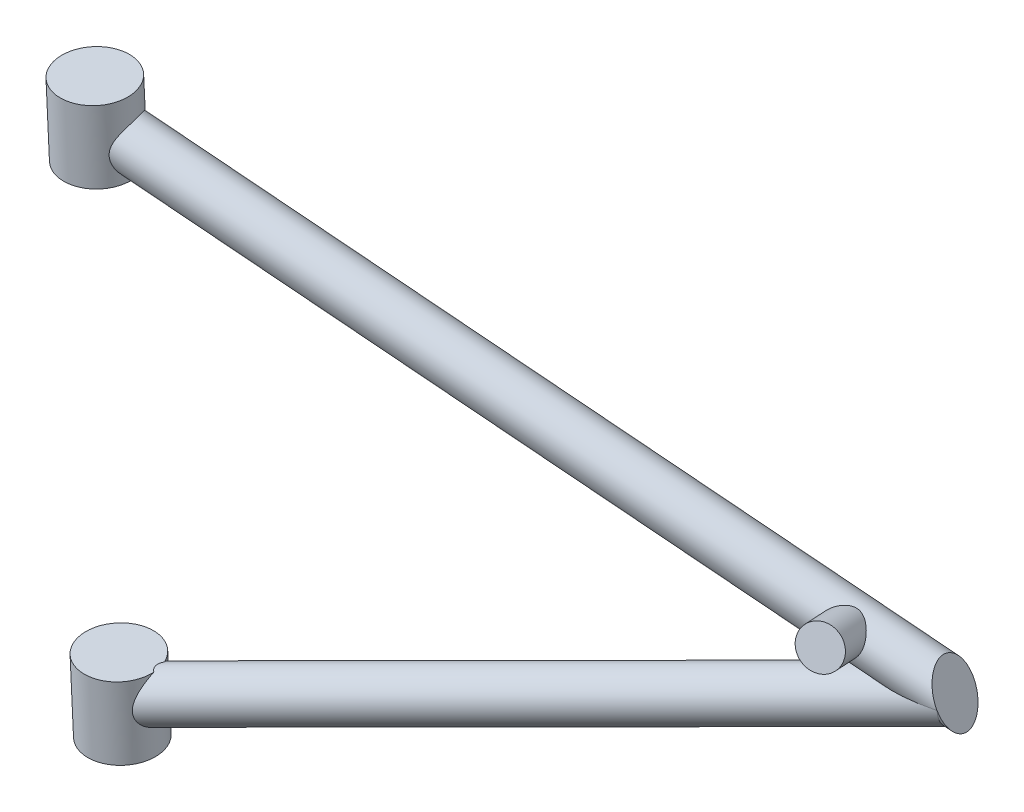
ISO-10303-21;
HEADER;
FILE_DESCRIPTION(('STEP AP214'),'2;1');
FILE_NAME('part.step','',(''),(''),'','','');
FILE_SCHEMA(('AUTOMOTIVE_DESIGN { 1 0 10303 214 1 1 1 1 }'));
ENDSEC;
DATA;
#1=APPLICATION_CONTEXT('core data for automotive mechanical design processes');
#2=APPLICATION_PROTOCOL_DEFINITION('international standard','automotive_design',2000,#1);
#3=PRODUCT_CONTEXT('',#1,'mechanical');
#4=PRODUCT('Part','Part','',(#3));
#5=PRODUCT_RELATED_PRODUCT_CATEGORY('part','',(#4));
#6=PRODUCT_DEFINITION_FORMATION('','',#4);
#7=PRODUCT_DEFINITION_CONTEXT('part definition',#1,'design');
#8=PRODUCT_DEFINITION('design','',#6,#7);
#9=PRODUCT_DEFINITION_SHAPE('','',#8);
#10=(LENGTH_UNIT() NAMED_UNIT(*) SI_UNIT(.MILLI.,.METRE.));
#11=(NAMED_UNIT(*) PLANE_ANGLE_UNIT() SI_UNIT($,.RADIAN.));
#12=(NAMED_UNIT(*) SI_UNIT($,.STERADIAN.) SOLID_ANGLE_UNIT());
#13=UNCERTAINTY_MEASURE_WITH_UNIT(LENGTH_MEASURE(1.E-05),#10,'distance_accuracy_value','');
#14=(GEOMETRIC_REPRESENTATION_CONTEXT(3) GLOBAL_UNCERTAINTY_ASSIGNED_CONTEXT((#13)) GLOBAL_UNIT_ASSIGNED_CONTEXT((#10,
#11,#12)) REPRESENTATION_CONTEXT('',''));
#15=CARTESIAN_POINT('',(0.,0.,0.));
#16=DIRECTION('',(0.,0.,1.));
#17=DIRECTION('',(1.,0.,0.));
#18=AXIS2_PLACEMENT_3D('',#15,#16,#17);
#19=CARTESIAN_POINT('',(255.,-221.47,-254.503));
#20=DIRECTION('',(0.912524270681738,0.366844617908996,-0.18089909266761));
#21=DIRECTION('',(-0.372998472957095,0.927831956321658,0.));
#22=AXIS2_PLACEMENT_3D('',#19,#20,#21);
#23=CYLINDRICAL_SURFACE('',#22,9.52500000000002);
#24=CARTESIAN_POINT('',(293.242179047782,-206.096230762816,-262.084141360994));
#25=DIRECTION('',(0.,0.998892249777093,0.0470560658710238));
#26=DIRECTION('',(0.977268280554209,0.00997618647777122,-0.211771536156257));
#27=AXIS2_PLACEMENT_3D('',#24,#25,#26);
#28=ELLIPSE('',#27,26.6116574264945,9.52500000000002);
#29=CARTESIAN_POINT('',(268.999181284131,-206.479491491884,-253.948395951266));
#30=VERTEX_POINT('',#29);
#31=CARTESIAN_POINT('',(267.803485256219,-206.220132528784,-259.453991316177));
#32=VERTEX_POINT('',#31);
#33=EDGE_CURVE('E105',#30,#32,#28,.F.);
#34=ORIENTED_EDGE('',*,*,#33,.F.);
#35=CARTESIAN_POINT('',(267.803485256219,-206.220132528784,-259.453991316177));
#36=CARTESIAN_POINT('',(267.697365527533,-206.314287046579,-259.698635479323));
#37=CARTESIAN_POINT('',(267.586764390849,-206.42159580225,-259.935753123484));
#38=CARTESIAN_POINT('',(267.3590656013,-206.659148812205,-260.394082141548));
#39=CARTESIAN_POINT('',(267.241984498495,-206.789336331361,-260.615330999056));
#40=CARTESIAN_POINT('',(266.886711742009,-207.206658583498,-261.250682509158));
#41=CARTESIAN_POINT('',(266.641879237606,-207.522929172958,-261.642177585505));
#42=CARTESIAN_POINT('',(266.235273501451,-208.092730241839,-262.239418803081));
#43=CARTESIAN_POINT('',(266.074316155262,-208.329666023735,-262.462324034543));
#44=CARTESIAN_POINT('',(265.753981376019,-208.824652753416,-262.884808049921));
#45=CARTESIAN_POINT('',(265.594604180185,-209.08270681934,-263.084383378549));
#46=CARTESIAN_POINT('',(265.279342301922,-209.618803267741,-263.462697257364));
#47=CARTESIAN_POINT('',(265.123488835937,-209.896969922729,-263.641284482501));
#48=CARTESIAN_POINT('',(264.819309695939,-210.469689099346,-263.97724993632));
#49=CARTESIAN_POINT('',(264.670983486587,-210.764240452564,-264.1346296746));
#50=CARTESIAN_POINT('',(264.381269831893,-211.376181258596,-264.432862120423));
#51=CARTESIAN_POINT('',(264.240163394191,-211.693965555147,-264.573178177829));
#52=CARTESIAN_POINT('',(263.973061649822,-212.344290165365,-264.832817021957));
#53=CARTESIAN_POINT('',(263.847070291525,-212.676834303664,-264.952134327155));
#54=CARTESIAN_POINT('',(263.615479530347,-213.35418344376,-265.169010362527));
#55=CARTESIAN_POINT('',(263.509796042121,-213.698930568173,-265.266659084283));
#56=CARTESIAN_POINT('',(263.323918613269,-214.40060892788,-265.439720146905));
#57=CARTESIAN_POINT('',(263.243704957851,-214.757530501437,-265.515149683131));
#58=CARTESIAN_POINT('',(263.140757197253,-215.337931157684,-265.616682171021));
#59=CARTESIAN_POINT('',(263.107839746575,-215.558288084853,-265.650490284906));
#60=CARTESIAN_POINT('',(263.055221234641,-216.001787504313,-265.708623035463));
#61=CARTESIAN_POINT('',(263.035515613435,-216.224929008417,-265.732950942932));
#62=CARTESIAN_POINT('',(263.010753298342,-216.6726776378,-265.771379849267));
#63=CARTESIAN_POINT('',(263.005680130779,-216.897282829338,-265.785492335551));
#64=CARTESIAN_POINT('',(263.011298244634,-217.346752682923,-265.80274430895));
#65=CARTESIAN_POINT('',(263.021989511733,-217.571617344735,-265.805883806031));
#66=CARTESIAN_POINT('',(263.059984423546,-218.021655112976,-265.800397176217));
#67=CARTESIAN_POINT('',(263.0874217406,-218.246816002228,-265.791675675815));
#68=CARTESIAN_POINT('',(263.159066383468,-218.693611930885,-265.761625241399));
#69=CARTESIAN_POINT('',(263.203273557364,-218.915247002211,-265.740296421595));
#70=CARTESIAN_POINT('',(263.30776437712,-219.353093275263,-265.684545181846));
#71=CARTESIAN_POINT('',(263.368053812421,-219.569302493014,-265.650118044742));
#72=CARTESIAN_POINT('',(263.503297097006,-219.994461443992,-265.567923797466));
#73=CARTESIAN_POINT('',(263.578250721479,-220.203411288453,-265.520156891796));
#74=CARTESIAN_POINT('',(263.733171590505,-220.593225138195,-265.416430865558));
#75=CARTESIAN_POINT('',(263.811987994475,-220.774872676237,-265.36167938882));
#76=CARTESIAN_POINT('',(263.978462432031,-221.130423154988,-265.241300951544));
#77=CARTESIAN_POINT('',(264.06612389616,-221.3043230528,-265.175669764933));
#78=CARTESIAN_POINT('',(264.24857889433,-221.643813586958,-265.03371158526));
#79=CARTESIAN_POINT('',(264.343372946659,-221.80940361801,-264.957383814584));
#80=CARTESIAN_POINT('',(264.538437505506,-222.131975916435,-264.794240719237));
#81=CARTESIAN_POINT('',(264.638708684581,-222.288957121931,-264.707424105006));
#82=CARTESIAN_POINT('',(264.856080793585,-222.613432512373,-264.511904137335));
#83=CARTESIAN_POINT('',(264.973706227715,-222.77974489652,-264.401821371604));
#84=CARTESIAN_POINT('',(265.211812817542,-223.101071675487,-264.168997659305));
#85=CARTESIAN_POINT('',(265.332294133555,-223.25608543406,-264.046256000829));
#86=CARTESIAN_POINT('',(265.574267969116,-223.554796284649,-263.788422034612));
#87=CARTESIAN_POINT('',(265.695760939554,-223.698487995004,-263.653323918668));
#88=CARTESIAN_POINT('',(265.937968608628,-223.9743822208,-263.371221770743));
#89=CARTESIAN_POINT('',(266.058683267141,-224.106584148258,-263.224217130196));
#90=CARTESIAN_POINT('',(266.316388873185,-224.379086894282,-262.894911525225));
#91=CARTESIAN_POINT('',(266.452983883531,-224.517438018628,-262.710680519274));
#92=CARTESIAN_POINT('',(266.720771944835,-224.778357387148,-262.327661237535));
#93=CARTESIAN_POINT('',(266.851964487,-224.900924147083,-262.128871595517));
#94=CARTESIAN_POINT('',(267.106914603057,-225.129934865831,-261.717650437763));
#95=CARTESIAN_POINT('',(267.230671343288,-225.236377018868,-261.505217397907));
#96=CARTESIAN_POINT('',(267.468876424041,-225.43271743723,-261.067853372235));
#97=CARTESIAN_POINT('',(267.583325023973,-225.522616163696,-260.842922735012));
#98=CARTESIAN_POINT('',(267.802315193678,-225.686237507517,-260.379654071813));
#99=CARTESIAN_POINT('',(267.906750630271,-225.759795842173,-260.141207706006));
#100=CARTESIAN_POINT('',(268.102975695885,-225.889205563581,-259.654493838866));
#101=CARTESIAN_POINT('',(268.194765111246,-225.945056651182,-259.406226171689));
#102=CARTESIAN_POINT('',(268.36445666864,-226.038678078082,-258.901741183751));
#103=CARTESIAN_POINT('',(268.44236278672,-226.076453599294,-258.645526163796));
#104=CARTESIAN_POINT('',(268.583397962621,-226.133680431828,-258.127059212255));
#105=CARTESIAN_POINT('',(268.646527716311,-226.15313260619,-257.864807565594));
#106=CARTESIAN_POINT('',(268.75456089052,-226.173041180107,-257.350001463026));
#107=CARTESIAN_POINT('',(268.800236085503,-226.17442507342,-257.097643977992));
#108=CARTESIAN_POINT('',(268.87754495621,-226.160559049983,-256.591249747588));
#109=CARTESIAN_POINT('',(268.909179149581,-226.145309746517,-256.337213064475));
#110=CARTESIAN_POINT('',(268.958465129282,-226.098254186145,-255.829342197431));
#111=CARTESIAN_POINT('',(268.97611791716,-226.066449115471,-255.575508000297));
#112=CARTESIAN_POINT('',(268.997780159279,-225.986437433502,-255.06985384672));
#113=CARTESIAN_POINT('',(269.001789410141,-225.938230577724,-254.818033920359));
#114=CARTESIAN_POINT('',(268.996762287689,-225.825707993507,-254.318544779101));
#115=CARTESIAN_POINT('',(268.987744850636,-225.761415759862,-254.070870067635));
#116=CARTESIAN_POINT('',(268.957530962621,-225.616923119472,-253.580973567274));
#117=CARTESIAN_POINT('',(268.936334552204,-225.536722765687,-253.338751760229));
#118=CARTESIAN_POINT('',(268.882802768389,-225.360597511825,-252.861222854839));
#119=CARTESIAN_POINT('',(268.850461702744,-225.264664589324,-252.625919356878));
#120=CARTESIAN_POINT('',(268.775907958965,-225.057297669075,-252.163861958913));
#121=CARTESIAN_POINT('',(268.733694983814,-224.94586320497,-251.937108316386));
#122=CARTESIAN_POINT('',(268.638427804418,-224.70137759742,-251.481962002));
#123=CARTESIAN_POINT('',(268.584920879624,-224.567498865722,-251.254107944126));
#124=CARTESIAN_POINT('',(268.470559133134,-224.282804564353,-250.811147094706));
#125=CARTESIAN_POINT('',(268.409703629115,-224.13198742202,-250.596041489638));
#126=CARTESIAN_POINT('',(268.282914006161,-223.81350185564,-250.180367343564));
#127=CARTESIAN_POINT('',(268.21698123708,-223.645837906937,-249.979794966055));
#128=CARTESIAN_POINT('',(268.082581578995,-223.293675776162,-249.59495297393));
#129=CARTESIAN_POINT('',(268.014115195036,-223.109180938497,-249.410680134762));
#130=CARTESIAN_POINT('',(267.889441483938,-222.757180467935,-249.090924796078));
#131=CARTESIAN_POINT('',(267.83317936084,-222.592326466294,-248.952538990793));
#132=CARTESIAN_POINT('',(267.722651266223,-222.25151404732,-248.689326778223));
#133=CARTESIAN_POINT('',(267.668384903767,-222.075557823276,-248.564497705929));
#134=CARTESIAN_POINT('',(267.563747133932,-221.713228224221,-248.329677098308));
#135=CARTESIAN_POINT('',(267.513370789218,-221.526868589261,-248.219666618114));
#136=CARTESIAN_POINT('',(267.4182587498,-221.144323935223,-248.015368122386));
#137=CARTESIAN_POINT('',(267.373523009128,-220.948138996235,-247.92107997872));
#138=CARTESIAN_POINT('',(267.291137225037,-220.546013503638,-247.748638257899));
#139=CARTESIAN_POINT('',(267.2535278762,-220.340024858359,-247.670577111481));
#140=CARTESIAN_POINT('',(267.187082074715,-219.920901255214,-247.531833206973));
#141=CARTESIAN_POINT('',(267.158245482821,-219.707766410837,-247.471150173047));
#142=CARTESIAN_POINT('',(267.110235562994,-219.276173299073,-247.367297249279));
#143=CARTESIAN_POINT('',(267.091064070753,-219.05771402867,-247.324130686644));
#144=CARTESIAN_POINT('',(267.062724596509,-218.617469337366,-247.255007864885));
#145=CARTESIAN_POINT('',(267.053556655437,-218.395683902859,-247.229051676181));
#146=CARTESIAN_POINT('',(267.045348670539,-217.968250588951,-247.19502778059));
#147=CARTESIAN_POINT('',(267.045565007181,-217.762713603364,-247.185707712271));
#148=CARTESIAN_POINT('',(267.053792930777,-217.351595295943,-247.180270105336));
#149=CARTESIAN_POINT('',(267.061807327794,-217.146013984837,-247.184157327279));
#150=CARTESIAN_POINT('',(267.096519483449,-216.530787761495,-247.214349430058));
#151=CARTESIAN_POINT('',(267.133884626441,-216.122537567518,-247.259176045046));
#152=CARTESIAN_POINT('',(267.222325638461,-215.381368977004,-247.380627271946));
#153=CARTESIAN_POINT('',(267.270207937088,-215.046942942879,-247.450938854214));
#154=CARTESIAN_POINT('',(267.377018936706,-214.386439361572,-247.618189330147));
#155=CARTESIAN_POINT('',(267.435954174913,-214.060366885459,-247.71514399763));
#156=CARTESIAN_POINT('',(267.561389779737,-213.416716646475,-247.9336507454));
#157=CARTESIAN_POINT('',(267.627918198398,-213.099176112066,-248.055295417468));
#158=CARTESIAN_POINT('',(267.765029228637,-212.474758490432,-248.321306075396));
#159=CARTESIAN_POINT('',(267.835611193412,-212.167879714442,-248.465668442679));
#160=CARTESIAN_POINT('',(267.980843351858,-211.553014635479,-248.782694691098));
#161=CARTESIAN_POINT('',(268.0555401776,-211.245519516577,-248.956290190469));
#162=CARTESIAN_POINT('',(268.202991109672,-210.644308733987,-249.32672039377));
#163=CARTESIAN_POINT('',(268.275745048135,-210.350594259308,-249.523557097843));
#164=CARTESIAN_POINT('',(268.415818484292,-209.780532346564,-249.939235286135));
#165=CARTESIAN_POINT('',(268.483167743511,-209.504091965957,-250.15793886129));
#166=CARTESIAN_POINT('',(268.609798910895,-208.969228518461,-250.618611208845));
#167=CARTESIAN_POINT('',(268.669081435061,-208.710804076553,-250.860578202365));
#168=CARTESIAN_POINT('',(268.765852461967,-208.26341636258,-251.318946387353));
#169=CARTESIAN_POINT('',(268.805338585521,-208.070684366789,-251.531243647368));
#170=CARTESIAN_POINT('',(268.874936386724,-207.701749340829,-251.970974377624));
#171=CARTESIAN_POINT('',(268.905055549102,-207.525533192642,-252.198395585667));
#172=CARTESIAN_POINT('',(268.95419156177,-207.190432647219,-252.670920659274));
#173=CARTESIAN_POINT('',(268.973077255322,-207.031769957774,-252.916197267341));
#174=CARTESIAN_POINT('',(268.997070890751,-206.73735109464,-253.421580500344));
#175=CARTESIAN_POINT('',(269.002142266349,-206.601656605006,-253.681724626914));
#176=CARTESIAN_POINT('',(268.999181284131,-206.479491491884,-253.948395951266));
#177=B_SPLINE_CURVE_WITH_KNOTS('',3,(#35,#36,#37,#38,#39,#40,#41,#42,#43,#44,#45,#46,#47,#48,
#49,#50,#51,#52,#53,#54,#55,#56,#57,#58,#59,#60,#61,#62,#63,#64,#65,#66,#67,#68,#69,#70,#71,#72,
#73,#74,#75,#76,#77,#78,#79,#80,#81,#82,#83,#84,#85,#86,#87,#88,#89,#90,#91,#92,#93,#94,#95,#96,
#97,#98,#99,#100,#101,#102,#103,#104,#105,#106,#107,#108,#109,#110,#111,#112,#113,#114,#115,
#116,#117,#118,#119,#120,#121,#122,#123,#124,#125,#126,#127,#128,#129,#130,#131,#132,#133,#134,
#135,#136,#137,#138,#139,#140,#141,#142,#143,#144,#145,#146,#147,#148,#149,#150,#151,#152,#153,
#154,#155,#156,#157,#158,#159,#160,#161,#162,#163,#164,#165,#166,#167,#168,#169,#170,#171,#172,
#173,#174,#175,#176),.UNSPECIFIED.,.F.,.F.,(4,2,2,2,2,2,2,2,2,2,2,2,2,2,2,2,2,2,2,2,2,2,2,2,2,2,
2,2,2,2,2,2,2,2,2,2,2,2,2,2,2,2,2,2,2,2,2,2,2,2,2,2,2,2,2,2,2,2,2,2,2,2,2,2,2,2,2,2,2,2,4),(0.,
0.847248957157209,1.69242580052789,3.3627657640452,4.45048572585789,5.53836658145481,
6.63366380567474,7.7288830228253,8.85260269563985,9.97661527103477,11.0958685200099,
12.214253292855,12.8897999019046,13.5651132316117,14.2396659749776,14.9142181056374,
15.594226457347,16.2742286490018,16.9544759652561,17.6347128537404,18.2503947330981,
18.8663163283093,19.4822827225457,20.0983249244541,20.7922888745161,21.4862918728688,
22.1806227833065,22.8749892047906,23.6775899204243,24.4802660513897,25.2830320066978,
26.0857755818625,26.8962571907386,27.7067524913827,28.517015299415,29.3272399417498,
30.0956997057354,30.8641311366941,31.6325075166236,32.4008953503885,33.1681673395538,
33.935436774422,34.7030986823461,35.4707836899619,36.2787608460513,37.0868130815586,
37.8946512231765,38.7023291903113,39.3690957519282,40.0357310011377,40.7015057318462,
41.3672750364114,42.0367385694382,42.7061914757579,43.3757714834116,44.0453542307185,
44.6619834053258,45.2788348670851,46.5121712393655,47.5460979811356,48.580638174395,
49.6191322393976,50.6574610554916,51.7392464537718,52.8211250187368,53.8965658681635,
54.9719245473783,55.8393415741109,56.7060636942321,57.5827161452231,58.4616868366877),.UNSPECIFIED.);
#178=EDGE_CURVE('E92',#32,#30,#177,.T.);
#179=ORIENTED_EDGE('',*,*,#178,.F.);
#180=EDGE_LOOP('',(#34,#179));
#181=FACE_BOUND('',#180,.T.);
#182=CARTESIAN_POINT('',(536.966082,-108.116588,-310.400043));
#183=DIRECTION('',(0.977042799081254,0.0314302037809526,-0.210711914835768));
#184=DIRECTION('',(-0.0209918277884314,0.998447490299481,0.0515941109116967));
#185=AXIS2_PLACEMENT_3D('',#182,#183,#184);
#186=ELLIPSE('',#185,10.1198136751925,9.525);
#187=CARTESIAN_POINT('',(538.985442921555,-108.554608710622,-301.10187413051));
#188=VERTEX_POINT('',#187);
#189=CARTESIAN_POINT('',(534.946721078445,-107.678567289377,-319.69821186949));
#190=VERTEX_POINT('',#189);
#191=EDGE_CURVE('E99',#188,#190,#186,.T.);
#192=ORIENTED_EDGE('',*,*,#191,.F.);
#193=CARTESIAN_POINT('',(536.966082,-108.116588,-310.400043));
#194=DIRECTION('',(-0.0209918277884314,0.998447490299481,0.0515941109116967));
#195=DIRECTION('',(0.977042799081254,0.0314302037809526,-0.210711914835768));
#196=AXIS2_PLACEMENT_3D('',#193,#194,#195);
#197=ELLIPSE('',#196,28.1983093968674,9.525);
#198=EDGE_CURVE('E127',#190,#188,#197,.T.);
#199=ORIENTED_EDGE('',*,*,#198,.F.);
#200=EDGE_LOOP('',(#192,#199));
#201=FACE_BOUND('',#200,.T.);
#202=ADVANCED_FACE('F73',(#181,#201),#23,.T.);
#203=CARTESIAN_POINT('',(255.,-14.5,-244.753));
#204=DIRECTION('',(0.926705770492292,-0.307678965136663,-0.215754650815965));
#205=DIRECTION('',(0.31510033175296,0.949058365396552,0.));
#206=AXIS2_PLACEMENT_3D('',#203,#204,#205);
#207=CYLINDRICAL_SURFACE('',#206,9.52499999999998);
#208=CARTESIAN_POINT('',(514.169204189501,-94.7190660498519,-296.745579792432));
#209=CARTESIAN_POINT('',(514.133007267729,-94.5160653435042,-296.856275994335));
#210=CARTESIAN_POINT('',(514.08578448019,-94.3166180222697,-296.969746028495));
#211=CARTESIAN_POINT('',(513.970908692809,-93.9259385091876,-297.200602301141));
#212=CARTESIAN_POINT('',(513.903245780682,-93.7347103546735,-297.317990415047));
#213=CARTESIAN_POINT('',(513.74912434652,-93.3611517284951,-297.555161649635));
#214=CARTESIAN_POINT('',(513.662637925749,-93.1788349610721,-297.674948083048));
#215=CARTESIAN_POINT('',(513.472633354761,-92.8238631872533,-297.915207480398));
#216=CARTESIAN_POINT('',(513.369117068813,-92.6512071260628,-298.035680367798));
#217=CARTESIAN_POINT('',(513.147823619821,-92.3175294461147,-298.274560445844));
#218=CARTESIAN_POINT('',(513.030216219965,-92.1564005655873,-298.392975768865));
#219=CARTESIAN_POINT('',(512.781162592786,-91.8436282290934,-298.627727350127));
#220=CARTESIAN_POINT('',(512.649716099833,-91.6919849552848,-298.744063568411));
#221=CARTESIAN_POINT('',(512.373771435176,-91.3976107957867,-298.973528804071));
#222=CARTESIAN_POINT('',(512.229243897256,-91.2549012437579,-299.086649816624));
#223=CARTESIAN_POINT('',(511.928287093365,-90.9784163249021,-299.307877314976));
#224=CARTESIAN_POINT('',(511.771856754468,-90.8446417655276,-299.415983347304));
#225=CARTESIAN_POINT('',(511.414884748606,-90.5592966703421,-299.646672945988));
#226=CARTESIAN_POINT('',(511.211834239835,-90.4096251751385,-299.76774138985));
#227=CARTESIAN_POINT('',(510.790260974796,-90.1216499553766,-299.996226709267));
#228=CARTESIAN_POINT('',(510.571727393619,-89.9833543331334,-300.103633884003));
#229=CARTESIAN_POINT('',(510.121002306358,-89.7179577534205,-300.298892918627));
#230=CARTESIAN_POINT('',(509.888876840893,-89.5908091219896,-300.386830786387));
#231=CARTESIAN_POINT('',(509.411519468311,-89.346551331602,-300.536266679784));
#232=CARTESIAN_POINT('',(509.166310594915,-89.2294254163693,-300.597809553116));
#233=CARTESIAN_POINT('',(508.675479204553,-89.0096864618262,-300.682972103926));
#234=CARTESIAN_POINT('',(508.430326600743,-88.9066661964136,-300.708106765221));
#235=CARTESIAN_POINT('',(508.059389703898,-88.7599249667645,-300.714271152759));
#236=CARTESIAN_POINT('',(507.935316789027,-88.7123467560065,-300.711085831095));
#237=CARTESIAN_POINT('',(507.686946006489,-88.6200062929786,-300.693458932524));
#238=CARTESIAN_POINT('',(507.56264826476,-88.5752427865811,-300.679022407695));
#239=CARTESIAN_POINT('',(507.314082291139,-88.4885790826255,-300.638349106497));
#240=CARTESIAN_POINT('',(507.18981918275,-88.4466987096293,-300.612038530842));
#241=CARTESIAN_POINT('',(506.943198590082,-88.366468857938,-300.547727449267));
#242=CARTESIAN_POINT('',(506.820841078542,-88.3281193286969,-300.509727110728));
#243=CARTESIAN_POINT('',(506.578777670487,-88.2552186794271,-300.422637623626));
#244=CARTESIAN_POINT('',(506.459075798495,-88.2206730467625,-300.373532759785));
#245=CARTESIAN_POINT('',(506.223085457555,-88.1556717580338,-300.265314961324));
#246=CARTESIAN_POINT('',(506.106798921231,-88.1252183840772,-300.206196483662));
#247=CARTESIAN_POINT('',(505.842530499445,-88.0597957651179,-300.059547277588));
#248=CARTESIAN_POINT('',(505.695904378876,-88.0263553688826,-299.968891299989));
#249=CARTESIAN_POINT('',(505.409202927294,-87.9669832519249,-299.775530035244));
#250=CARTESIAN_POINT('',(505.269131526012,-87.9410559883675,-299.672817646189));
#251=CARTESIAN_POINT('',(504.994809526467,-87.8967318858688,-299.457717144608));
#252=CARTESIAN_POINT('',(504.860575499057,-87.8783553738946,-299.345303887403));
#253=CARTESIAN_POINT('',(504.597739228604,-87.8492639759607,-299.113249089857));
#254=CARTESIAN_POINT('',(504.469136100004,-87.8385478811748,-298.993608693205));
#255=CARTESIAN_POINT('',(504.143965208982,-87.8208393273718,-298.678118295431));
#256=CARTESIAN_POINT('',(503.951047719756,-87.8195731311057,-298.478165684639));
#257=CARTESIAN_POINT('',(503.575245135472,-87.83653762547,-298.069782129547));
#258=CARTESIAN_POINT('',(503.392365277379,-87.854778393764,-297.861346856482));
#259=CARTESIAN_POINT('',(503.034986937556,-87.9114209432613,-297.439648609524));
#260=CARTESIAN_POINT('',(502.860498597265,-87.9498464816965,-297.226380230756));
#261=CARTESIAN_POINT('',(502.519333419917,-88.0477217022017,-296.798483199314));
#262=CARTESIAN_POINT('',(502.352655057934,-88.1071672605046,-296.583854821555));
#263=CARTESIAN_POINT('',(502.023257292888,-88.2496584585517,-296.151398810115));
#264=CARTESIAN_POINT('',(501.860704407351,-88.3331921975902,-295.933603982209));
#265=CARTESIAN_POINT('',(501.543757947078,-88.524498080237,-295.502622373165));
#266=CARTESIAN_POINT('',(501.389365957996,-88.6322749130265,-295.28943649226));
#267=CARTESIAN_POINT('',(501.09013589939,-88.8727893437832,-294.871701898394));
#268=CARTESIAN_POINT('',(500.945269834456,-89.0054489390087,-294.66712857641));
#269=CARTESIAN_POINT('',(500.666042357054,-89.2967149374082,-294.26967038339));
#270=CARTESIAN_POINT('',(500.531674155719,-89.4553043632837,-294.076777976882));
#271=CARTESIAN_POINT('',(500.319846704251,-89.7389187880407,-293.770994127661));
#272=CARTESIAN_POINT('',(500.238830725277,-89.8564707785566,-293.653585430821));
#273=CARTESIAN_POINT('',(500.08266216752,-90.1025169841681,-293.426621847645));
#274=CARTESIAN_POINT('',(500.007507946782,-90.2310081138191,-293.317064762671));
#275=CARTESIAN_POINT('',(499.863726077517,-90.4985084674655,-293.107026004267));
#276=CARTESIAN_POINT('',(499.795095036194,-90.6375121554247,-293.006539614425));
#277=CARTESIAN_POINT('',(499.664952057729,-90.9254873020599,-292.815710334687));
#278=CARTESIAN_POINT('',(499.603440378404,-91.0744591214088,-292.725367812139));
#279=CARTESIAN_POINT('',(499.487886622915,-91.3821759376889,-292.555485492624));
#280=CARTESIAN_POINT('',(499.433879108829,-91.5409615850629,-292.475995707735));
#281=CARTESIAN_POINT('',(499.334190600604,-91.8665665319187,-292.329165687326));
#282=CARTESIAN_POINT('',(499.288509570339,-92.0333857965399,-292.261825399091));
#283=CARTESIAN_POINT('',(499.205881661968,-92.3737216253946,-292.139921759093));
#284=CARTESIAN_POINT('',(499.168934854958,-92.5472382441314,-292.085358511335));
#285=CARTESIAN_POINT('',(499.104036521261,-92.8994964780874,-291.989359472062));
#286=CARTESIAN_POINT('',(499.076084697129,-93.0782379203199,-291.947923246467));
#287=CARTESIAN_POINT('',(499.030824426184,-93.4274868171359,-291.880536096565));
#288=CARTESIAN_POINT('',(499.01293478214,-93.5977580281643,-291.853742929249));
#289=CARTESIAN_POINT('',(498.985049081863,-93.9403885565148,-291.81147258599));
#290=CARTESIAN_POINT('',(498.975055729233,-94.1127485685283,-291.795999285977));
#291=CARTESIAN_POINT('',(498.96284961305,-94.4583169655787,-291.776041161248));
#292=CARTESIAN_POINT('',(498.960634419466,-94.6315250687195,-291.771552904748));
#293=CARTESIAN_POINT('',(498.963774778111,-94.9778492421878,-291.773053837735));
#294=CARTESIAN_POINT('',(498.969133153051,-95.1509652541321,-291.779046933878));
#295=CARTESIAN_POINT('',(498.997682198773,-95.6965730417662,-291.813666346768));
#296=CARTESIAN_POINT('',(499.034348534859,-96.0673796381775,-291.8604835866));
#297=CARTESIAN_POINT('',(499.139324516568,-96.7971425632779,-291.993544519242));
#298=CARTESIAN_POINT('',(499.207660549013,-97.1560887423178,-292.079821088318));
#299=CARTESIAN_POINT('',(499.352367151631,-97.7670607985017,-292.258125511583));
#300=CARTESIAN_POINT('',(499.422142068088,-98.0228261111553,-292.342956779145));
#301=CARTESIAN_POINT('',(499.577495462299,-98.5241159770134,-292.527488752057));
#302=CARTESIAN_POINT('',(499.663081145725,-98.769635798094,-292.627196233158));
#303=CARTESIAN_POINT('',(499.850166402708,-99.2496738586306,-292.838733176331));
#304=CARTESIAN_POINT('',(499.951694566248,-99.4841713304033,-292.950584302454));
#305=CARTESIAN_POINT('',(500.171095336042,-99.940671422803,-293.183216979391));
#306=CARTESIAN_POINT('',(500.28896243104,-100.162678221284,-293.303995512532));
#307=CARTESIAN_POINT('',(500.51139263988,-100.540460089017,-293.520893789536));
#308=CARTESIAN_POINT('',(500.612165821834,-100.699160410391,-293.615825050704));
#309=CARTESIAN_POINT('',(500.824737480103,-101.008140290227,-293.807146076483));
#310=CARTESIAN_POINT('',(500.936536981562,-101.158419063675,-293.903535976));
#311=CARTESIAN_POINT('',(501.172094968746,-101.449228633924,-294.095440580669));
#312=CARTESIAN_POINT('',(501.295824322343,-101.58978180604,-294.190956824007));
#313=CARTESIAN_POINT('',(501.556781968874,-101.860019980385,-294.378640476281));
#314=CARTESIAN_POINT('',(501.694002981707,-101.989710774746,-294.470809654922));
#315=CARTESIAN_POINT('',(502.027031787875,-102.273314785888,-294.675217647482));
#316=CARTESIAN_POINT('',(502.228093476873,-102.422885442264,-294.785223457051));
#317=CARTESIAN_POINT('',(502.549619110145,-102.626215804072,-294.935094455254));
#318=CARTESIAN_POINT('',(502.660039743894,-102.6904540405,-294.982503081918));
#319=CARTESIAN_POINT('',(502.887359832988,-102.811147350449,-295.071239153591));
#320=CARTESIAN_POINT('',(503.004255998098,-102.867606326688,-295.112569648598));
#321=CARTESIAN_POINT('',(503.245024704889,-102.972430821692,-295.188580432235));
#322=CARTESIAN_POINT('',(503.368948910135,-103.020721989747,-295.223200008392));
#323=CARTESIAN_POINT('',(503.621867091331,-103.108022563232,-295.28476653966));
#324=CARTESIAN_POINT('',(503.750860893143,-103.147032287151,-295.31171375805));
#325=CARTESIAN_POINT('',(504.012811078171,-103.215538701827,-295.3578595983));
#326=CARTESIAN_POINT('',(504.145770725613,-103.245027305883,-295.377051636809));
#327=CARTESIAN_POINT('',(504.414334258294,-103.294554629992,-295.408045905695));
#328=CARTESIAN_POINT('',(504.549939595334,-103.314588000492,-295.419843953957));
#329=CARTESIAN_POINT('',(504.853472315069,-103.349070921312,-295.438696796077));
#330=CARTESIAN_POINT('',(505.021762973551,-103.361227572166,-295.444071696161));
#331=CARTESIAN_POINT('',(505.358858742802,-103.372902965597,-295.446572709658));
#332=CARTESIAN_POINT('',(505.527664082589,-103.372414869201,-295.443694360009));
#333=CARTESIAN_POINT('',(505.865046148843,-103.359917602686,-295.431533688788));
#334=CARTESIAN_POINT('',(506.03362093812,-103.34787643689,-295.422233602579));
#335=CARTESIAN_POINT('',(506.369295689471,-103.313283707512,-295.39893972994));
#336=CARTESIAN_POINT('',(506.536395828898,-103.290733425902,-295.384946516067));
#337=CARTESIAN_POINT('',(506.968563874928,-103.219572015679,-295.344422037574));
#338=CARTESIAN_POINT('',(507.232173407946,-103.163443302678,-295.315408946221));
#339=CARTESIAN_POINT('',(507.753393654294,-103.029197899342,-295.254219336863));
#340=CARTESIAN_POINT('',(508.011000961532,-102.951069038475,-295.222041074306));
#341=CARTESIAN_POINT('',(508.519542665,-102.774388367659,-295.158257326378));
#342=CARTESIAN_POINT('',(508.770468377866,-102.67581131781,-295.126652601875));
#343=CARTESIAN_POINT('',(509.264225171758,-102.459330921851,-295.067086971237));
#344=CARTESIAN_POINT('',(509.507057885587,-102.341431502877,-295.03912532674));
#345=CARTESIAN_POINT('',(509.991110712266,-102.082749333916,-294.988571482333));
#346=CARTESIAN_POINT('',(510.232022963279,-101.941348317758,-294.966182894059));
#347=CARTESIAN_POINT('',(510.702046962843,-101.638948083046,-294.930470402227));
#348=CARTESIAN_POINT('',(510.931156495159,-101.477945202738,-294.917148195399));
#349=CARTESIAN_POINT('',(511.374504241344,-101.137248593154,-294.90187883843));
#350=CARTESIAN_POINT('',(511.588781342616,-100.957607084423,-294.899900736798));
#351=CARTESIAN_POINT('',(512.000126304547,-100.579959490594,-294.909347862842));
#352=CARTESIAN_POINT('',(512.197203821413,-100.381963840346,-294.920765517173));
#353=CARTESIAN_POINT('',(512.510024508572,-100.035915751584,-294.952661951486));
#354=CARTESIAN_POINT('',(512.631392348757,-99.8925327296986,-294.968992457227));
#355=CARTESIAN_POINT('',(512.863567944662,-99.5984621237205,-295.009083382801));
#356=CARTESIAN_POINT('',(512.974378560956,-99.4477765351145,-295.032841782464));
#357=CARTESIAN_POINT('',(513.184221398508,-99.1398606789782,-295.088158082519));
#358=CARTESIAN_POINT('',(513.283258707535,-98.982633278402,-295.119712595582));
#359=CARTESIAN_POINT('',(513.468446657896,-98.6624847151865,-295.190864455711));
#360=CARTESIAN_POINT('',(513.554596988316,-98.4995634152926,-295.230461996768));
#361=CARTESIAN_POINT('',(513.713382015318,-98.1682171647042,-295.318009793616));
#362=CARTESIAN_POINT('',(513.78593740784,-97.9997662710905,-295.366006082163));
#363=CARTESIAN_POINT('',(513.916014754951,-97.6595671051958,-295.470054708208));
#364=CARTESIAN_POINT('',(513.973536358425,-97.4878187560034,-295.526107233812));
#365=CARTESIAN_POINT('',(514.072861335546,-97.142553561405,-295.645887390089));
#366=CARTESIAN_POINT('',(514.114672389207,-96.9690376227964,-295.709611250504));
#367=CARTESIAN_POINT('',(514.182268242567,-96.6217088624713,-295.844169403773));
#368=CARTESIAN_POINT('',(514.208055602929,-96.4478960926438,-295.915002558425));
#369=CARTESIAN_POINT('',(514.252945756861,-96.0098083728094,-296.102222181853));
#370=CARTESIAN_POINT('',(514.26133648031,-95.7462078173231,-296.222919240345));
#371=CARTESIAN_POINT('',(514.241835709987,-95.2262838101062,-296.476191083231));
#372=CARTESIAN_POINT('',(514.213941099624,-94.9699609854008,-296.608766886991));
#373=CARTESIAN_POINT('',(514.169204189501,-94.7190660498519,-296.745579792432));
#374=B_SPLINE_CURVE_WITH_KNOTS('',3,(#208,#209,#210,#211,#212,#213,#214,#215,#216,#217,#218,
#219,#220,#221,#222,#223,#224,#225,#226,#227,#228,#229,#230,#231,#232,#233,#234,#235,#236,#237,
#238,#239,#240,#241,#242,#243,#244,#245,#246,#247,#248,#249,#250,#251,#252,#253,#254,#255,#256,
#257,#258,#259,#260,#261,#262,#263,#264,#265,#266,#267,#268,#269,#270,#271,#272,#273,#274,#275,
#276,#277,#278,#279,#280,#281,#282,#283,#284,#285,#286,#287,#288,#289,#290,#291,#292,#293,#294,
#295,#296,#297,#298,#299,#300,#301,#302,#303,#304,#305,#306,#307,#308,#309,#310,#311,#312,#313,
#314,#315,#316,#317,#318,#319,#320,#321,#322,#323,#324,#325,#326,#327,#328,#329,#330,#331,#332,
#333,#334,#335,#336,#337,#338,#339,#340,#341,#342,#343,#344,#345,#346,#347,#348,#349,#350,#351,
#352,#353,#354,#355,#356,#357,#358,#359,#360,#361,#362,#363,#364,#365,#366,#367,#368,#369,#370,
#371,#372,#373),.UNSPECIFIED.,.T.,.F.,(4,2,2,2,2,2,2,2,2,2,2,2,2,2,2,2,2,2,2,2,2,2,2,2,2,2,2,2,
2,2,2,2,2,2,2,2,2,2,2,2,2,2,2,2,2,2,2,2,2,2,2,2,2,2,2,2,2,2,2,2,2,2,2,2,2,2,2,2,2,2,2,2,2,2,2,2,
2,2,2,2,2,2,4),(0.,0.701737679812384,1.40381620984343,2.10694247923585,2.80999182808281,
3.50529198938806,4.20060549888495,4.89752061519718,5.5944986265289,6.43294232936725,
7.27197812314835,8.10722995238783,8.94105692948365,9.73907842527756,10.1374090285416,
10.5355608741445,10.9362221279863,11.3368776452496,11.7381037641584,12.1395527122179,
12.6655122827506,13.1917832429053,13.7194618101273,14.2470570904276,15.0794034723713,
15.9121800678815,16.745939034909,17.5795345234078,18.4313765502955,19.2833834852464,
20.1327628750205,20.9815883528362,21.535602256957,22.0894604128451,22.6430289047254,
23.1966174369965,23.7526766366519,24.3087334235993,24.8647947367128,25.4208376602177,
25.9401423597301,26.4596247864316,26.9789449034314,27.4984586250184,28.6206497686843,
29.7437775945763,30.5778129346653,31.4122293238435,32.2481595483659,33.0838084898566,
33.7152047838347,34.3466598357335,34.9766101810614,35.6062224514129,36.4239775125495,
36.8323345157387,37.2404859015756,37.6521731018942,38.0638461733118,38.4758679823936,
38.8881226253328,39.3937643966004,39.8996796524002,40.4070000728834,40.9142586232511,
41.7262822292429,42.5387559340017,43.352238534966,44.1655560058803,45.0052576445428,
45.8451163861964,46.6826825456889,47.5197754118259,48.0849442075472,48.649959427541,
49.2147295848924,49.7795133657342,50.3474956036566,50.9154911056237,51.4832085838208,
52.0508353147033,52.9180604155819,53.7853600083583),.UNSPECIFIED.);
#375=CARTESIAN_POINT('',(514.169204189501,-94.7190660498519,-296.745579792432));
#376=VERTEX_POINT('',#375);
#377=EDGE_CURVE('E12',#376,#376,#374,.T.);
#378=ORIENTED_EDGE('',*,*,#377,.F.);
#379=EDGE_LOOP('',(#378));
#380=FACE_BOUND('',#379,.T.);
#381=CARTESIAN_POINT('',(268.726824760883,-9.02122951178209,-247.250098117072));
#382=CARTESIAN_POINT('',(268.676288530235,-9.00445198597454,-247.501640042863));
#383=CARTESIAN_POINT('',(268.618762691404,-8.99633112635366,-247.752376592043));
#384=CARTESIAN_POINT('',(268.4902025195,-8.99747023854408,-248.250336732159));
#385=CARTESIAN_POINT('',(268.419166756123,-9.00673205158942,-248.497559948154));
#386=CARTESIAN_POINT('',(268.26430576037,-9.04257696507422,-248.986808957903));
#387=CARTESIAN_POINT('',(268.180474735553,-9.06916792837075,-249.228832340788));
#388=CARTESIAN_POINT('',(268.001055496051,-9.13949319043361,-249.705915076184));
#389=CARTESIAN_POINT('',(267.905467525869,-9.18322713272696,-249.940974573394));
#390=CARTESIAN_POINT('',(267.704010049842,-9.28743506475234,-250.402102427346));
#391=CARTESIAN_POINT('',(267.59816639998,-9.34786763304748,-250.628191468837));
#392=CARTESIAN_POINT('',(267.37740915214,-9.48519116807679,-251.07072761641));
#393=CARTESIAN_POINT('',(267.262495497646,-9.56208223736834,-251.2871746624));
#394=CARTESIAN_POINT('',(267.025135257315,-9.73200191766136,-251.709419423601));
#395=CARTESIAN_POINT('',(266.902686502832,-9.82503518863161,-251.91521404131));
#396=CARTESIAN_POINT('',(266.652004823838,-10.0268960232909,-252.315201896446));
#397=CARTESIAN_POINT('',(266.523771766162,-10.135723950729,-252.509394866543));
#398=CARTESIAN_POINT('',(266.257990376271,-10.37372353331,-252.893239052608));
#399=CARTESIAN_POINT('',(266.120276202222,-10.5035511022297,-253.082369018426));
#400=CARTESIAN_POINT('',(265.842879496114,-10.7797917911539,-253.446577113206));
#401=CARTESIAN_POINT('',(265.703196820934,-10.9262061226147,-253.621654214184));
#402=CARTESIAN_POINT('',(265.424383563167,-11.2354446840216,-253.957164411029));
#403=CARTESIAN_POINT('',(265.285252996112,-11.3982693722353,-254.117597097705));
#404=CARTESIAN_POINT('',(265.010343203832,-11.7401856535472,-254.423270297936));
#405=CARTESIAN_POINT('',(264.874563513612,-11.9192749733077,-254.568512928546));
#406=CARTESIAN_POINT('',(264.628040923878,-12.267307728285,-254.824035864827));
#407=CARTESIAN_POINT('',(264.516456347192,-12.43415469064,-254.936363174754));
#408=CARTESIAN_POINT('',(264.300224103738,-12.7795307333661,-255.149079245481));
#409=CARTESIAN_POINT('',(264.195575195986,-12.958057712435,-255.249470144605));
#410=CARTESIAN_POINT('',(263.99561101844,-13.3262181674255,-255.43789563867));
#411=CARTESIAN_POINT('',(263.900285459151,-13.515839021735,-255.525943902869));
#412=CARTESIAN_POINT('',(263.721185832183,-13.9056787326092,-255.689509327515));
#413=CARTESIAN_POINT('',(263.637411641543,-14.1058974763313,-255.765026621352));
#414=CARTESIAN_POINT('',(263.483061700098,-14.5174320546719,-255.90382351464));
#415=CARTESIAN_POINT('',(263.412592894543,-14.7288216595263,-255.967004082436));
#416=CARTESIAN_POINT('',(263.287610092421,-15.1596821705019,-256.080277081496));
#417=CARTESIAN_POINT('',(263.233095631416,-15.3791528411706,-256.130369893746));
#418=CARTESIAN_POINT('',(263.141372793277,-15.8241215844694,-256.217531734547));
#419=CARTESIAN_POINT('',(263.104157846816,-16.049617334677,-256.254605705569));
#420=CARTESIAN_POINT('',(263.047547142388,-16.504520885996,-256.316057701449));
#421=CARTESIAN_POINT('',(263.028150729856,-16.7339285430879,-256.340436192663));
#422=CARTESIAN_POINT('',(263.008147517757,-17.1671959806575,-256.374834768234));
#423=CARTESIAN_POINT('',(263.005587390457,-17.3708635549028,-256.38621346761));
#424=CARTESIAN_POINT('',(263.013423633696,-17.7782789631749,-256.399930904499));
#425=CARTESIAN_POINT('',(263.023824632083,-17.9820267998868,-256.402266411863));
#426=CARTESIAN_POINT('',(263.0731348909,-18.5918328562219,-256.396378199163));
#427=CARTESIAN_POINT('',(263.130151891372,-18.9964409360988,-256.375258802721));
#428=CARTESIAN_POINT('',(263.267231293086,-19.7115667802688,-256.309632909995));
#429=CARTESIAN_POINT('',(263.340027517566,-20.024140917216,-256.270908733129));
#430=CARTESIAN_POINT('',(263.5055674067,-20.6412662141407,-256.17516250565));
#431=CARTESIAN_POINT('',(263.598321825263,-20.9458129490835,-256.118130582245));
#432=CARTESIAN_POINT('',(263.799977631537,-21.5463255489647,-255.986321595786));
#433=CARTESIAN_POINT('',(263.908916712175,-21.842269401345,-255.911502857612));
#434=CARTESIAN_POINT('',(264.139319909855,-22.4241037243651,-255.744444398948));
#435=CARTESIAN_POINT('',(264.260782060857,-22.7099957636511,-255.652207411125));
#436=CARTESIAN_POINT('',(264.518273357768,-23.2820834100239,-255.446189945533));
#437=CARTESIAN_POINT('',(264.654686517617,-23.5678532153795,-255.331707742645));
#438=CARTESIAN_POINT('',(264.935086867388,-24.1269581013663,-255.083176933669));
#439=CARTESIAN_POINT('',(265.07907503956,-24.4002915607677,-254.949125786062));
#440=CARTESIAN_POINT('',(265.371833191247,-24.9328068305056,-254.660802140949));
#441=CARTESIAN_POINT('',(265.520596114291,-25.1920081230896,-254.50655853266));
#442=CARTESIAN_POINT('',(265.82060268252,-25.6948392265771,-254.176631414043));
#443=CARTESIAN_POINT('',(265.971845609508,-25.9384734489337,-254.000954019127));
#444=CARTESIAN_POINT('',(266.238676319168,-26.352537856558,-253.670966430631));
#445=CARTESIAN_POINT('',(266.354281833975,-26.5267059850453,-253.521351987368));
#446=CARTESIAN_POINT('',(266.584224114413,-26.8631525877641,-253.208346635083));
#447=CARTESIAN_POINT('',(266.698560915827,-27.0254313980387,-253.044956115713));
#448=CARTESIAN_POINT('',(266.924479383203,-27.3362632983389,-252.70415754013));
#449=CARTESIAN_POINT('',(267.036063645957,-27.4848297185091,-252.526763415229));
#450=CARTESIAN_POINT('',(267.255039467324,-27.7664131295551,-252.157647868692));
#451=CARTESIAN_POINT('',(267.362432451144,-27.8994354372983,-251.965931383022));
#452=CARTESIAN_POINT('',(267.550344550156,-28.1227776492559,-251.608278452165));
#453=CARTESIAN_POINT('',(267.631927577974,-28.2163071954066,-251.444902454867));
#454=CARTESIAN_POINT('',(267.790374647105,-28.3907890051595,-251.109476653143));
#455=CARTESIAN_POINT('',(267.867241301295,-28.4717482714663,-250.9374317493));
#456=CARTESIAN_POINT('',(268.01530363148,-28.619897644449,-250.585235195171));
#457=CARTESIAN_POINT('',(268.086501600706,-28.6870933365689,-250.405086869704));
#458=CARTESIAN_POINT('',(268.222306872138,-28.806615573027,-250.037493012394));
#459=CARTESIAN_POINT('',(268.286914142955,-28.8589420465497,-249.850047445803));
#460=CARTESIAN_POINT('',(268.409046184096,-28.9480438917704,-249.467819731855));
#461=CARTESIAN_POINT('',(268.466522366864,-28.9847163359656,-249.272997926722));
#462=CARTESIAN_POINT('',(268.573140792532,-29.0413117188694,-248.878685628907));
#463=CARTESIAN_POINT('',(268.622283046722,-29.0612346802655,-248.67919514255));
#464=CARTESIAN_POINT('',(268.711681410468,-29.0839959537429,-248.277299485232));
#465=CARTESIAN_POINT('',(268.751938745158,-29.0868366227073,-248.074894720225));
#466=CARTESIAN_POINT('',(268.823289630843,-29.0755140053631,-247.668961678572));
#467=CARTESIAN_POINT('',(268.854383615496,-29.0613515238959,-247.465433455559));
#468=CARTESIAN_POINT('',(268.904801786241,-29.0186999138597,-247.078966926209));
#469=CARTESIAN_POINT('',(268.924981038937,-28.9917515757181,-246.895966354055));
#470=CARTESIAN_POINT('',(268.958064013113,-28.9249745078107,-246.531605969082));
#471=CARTESIAN_POINT('',(268.970965059182,-28.8851410500324,-246.350246783697));
#472=CARTESIAN_POINT('',(268.989793396049,-28.7933263723226,-245.990275203744));
#473=CARTESIAN_POINT('',(268.995720570564,-28.7413449498529,-245.811662855028));
#474=CARTESIAN_POINT('',(269.001025347498,-28.6260569238007,-245.458019234233));
#475=CARTESIAN_POINT('',(269.000401527856,-28.5627478642001,-245.28298874795));
#476=CARTESIAN_POINT('',(268.99165195885,-28.3986733966934,-244.869122410357));
#477=CARTESIAN_POINT('',(268.98066984623,-28.2929735056765,-244.632291259126));
#478=CARTESIAN_POINT('',(268.948385099839,-28.0635504732574,-244.168261413666));
#479=CARTESIAN_POINT('',(268.927079042074,-27.9398213618909,-243.94106594237));
#480=CARTESIAN_POINT('',(268.875600840143,-27.6762679414899,-243.496810164444));
#481=CARTESIAN_POINT('',(268.845414580554,-27.5364182250289,-243.279766636226));
#482=CARTESIAN_POINT('',(268.777653421011,-27.2426584721528,-242.856685745628));
#483=CARTESIAN_POINT('',(268.740078315457,-27.0887480445503,-242.650648689715));
#484=CARTESIAN_POINT('',(268.643386483254,-26.7070822330017,-242.173026496221));
#485=CARTESIAN_POINT('',(268.581530156878,-26.4736150303135,-241.906546891847));
#486=CARTESIAN_POINT('',(268.449793003767,-25.9860455351558,-241.395296604415));
#487=CARTESIAN_POINT('',(268.379908970078,-25.7319350079263,-241.150534666946));
#488=CARTESIAN_POINT('',(268.235217433814,-25.2048385830268,-240.682382562861));
#489=CARTESIAN_POINT('',(268.160397503455,-24.9318049453811,-240.45905011023));
#490=CARTESIAN_POINT('',(268.00928117974,-24.3692117493213,-240.034948103136));
#491=CARTESIAN_POINT('',(267.932984987262,-24.0796544290064,-239.834175503873));
#492=CARTESIAN_POINT('',(267.780354614498,-23.4774373291483,-239.451118710635));
#493=CARTESIAN_POINT('',(267.704070744199,-23.1643731990062,-239.2694488849));
#494=CARTESIAN_POINT('',(267.557528007869,-22.5228634270082,-238.932359860162));
#495=CARTESIAN_POINT('',(267.48727104527,-22.1944129760741,-238.776948939392));
#496=CARTESIAN_POINT('',(267.357638693295,-21.5245086942079,-238.495699153315));
#497=CARTESIAN_POINT('',(267.298221230536,-21.1831116344125,-238.369745388929));
#498=CARTESIAN_POINT('',(267.195077168894,-20.4877413538703,-238.150563149337));
#499=CARTESIAN_POINT('',(267.151335785603,-20.1337803306224,-238.057303841185));
#500=CARTESIAN_POINT('',(267.098540172103,-19.5641256360974,-237.939120561874));
#501=CARTESIAN_POINT('',(267.082619957234,-19.3515806267613,-237.901874421257));
#502=CARTESIAN_POINT('',(267.059008416033,-18.9240682133002,-237.84149928021));
#503=CARTESIAN_POINT('',(267.051314145636,-18.7091017036844,-237.818365230336));
#504=CARTESIAN_POINT('',(267.044953531713,-18.2781857655523,-237.787305684723));
#505=CARTESIAN_POINT('',(267.04627587948,-18.0622379076186,-237.779361154192));
#506=CARTESIAN_POINT('',(267.058392872335,-17.6305877960783,-237.779550424714));
#507=CARTESIAN_POINT('',(267.069187592679,-17.4148855444368,-237.787684353508));
#508=CARTESIAN_POINT('',(267.100361653992,-16.9843018184482,-237.820759015783));
#509=CARTESIAN_POINT('',(267.120791424559,-16.769430731762,-237.845788480904));
#510=CARTESIAN_POINT('',(267.170767400276,-16.3434622054168,-237.912997356413));
#511=CARTESIAN_POINT('',(267.200313653999,-16.1323647858708,-237.955176858179));
#512=CARTESIAN_POINT('',(267.267565233735,-15.7154611340881,-238.056546867933));
#513=CARTESIAN_POINT('',(267.305276825023,-15.5096591014379,-238.115750450031));
#514=CARTESIAN_POINT('',(267.387470310165,-15.1049247720286,-238.25060045492));
#515=CARTESIAN_POINT('',(267.431952283366,-14.9059925558149,-238.326247070423));
#516=CARTESIAN_POINT('',(267.523400302146,-14.5271276802228,-238.488421201792));
#517=CARTESIAN_POINT('',(267.570083125769,-14.3467569947386,-238.574090202722));
#518=CARTESIAN_POINT('',(267.666615954268,-13.9936545286482,-238.758536391542));
#519=CARTESIAN_POINT('',(267.71646718663,-13.8209257531272,-238.857318676041));
#520=CARTESIAN_POINT('',(267.817892035837,-13.4836141022372,-239.067097201745));
#521=CARTESIAN_POINT('',(267.86946556749,-13.3190308249573,-239.178092839452));
#522=CARTESIAN_POINT('',(267.972983266519,-12.9982498891615,-239.411457750653));
#523=CARTESIAN_POINT('',(268.024927478074,-12.8420532497334,-239.533828401448));
#524=CARTESIAN_POINT('',(268.136276284712,-12.5135604042263,-239.809846608741));
#525=CARTESIAN_POINT('',(268.195523474195,-12.3427654691848,-239.965347052666));
#526=CARTESIAN_POINT('',(268.310985581411,-12.0129307036202,-240.289391481785));
#527=CARTESIAN_POINT('',(268.367200259503,-11.8538918017375,-240.457936495255));
#528=CARTESIAN_POINT('',(268.475003110589,-11.5476298350489,-240.807046987239));
#529=CARTESIAN_POINT('',(268.526588011956,-11.4004151334004,-240.987620811335));
#530=CARTESIAN_POINT('',(268.6236225188,-11.1181177051641,-241.359577026843));
#531=CARTESIAN_POINT('',(268.669071891497,-10.9830354389418,-241.550959827954));
#532=CARTESIAN_POINT('',(268.758521739242,-10.7067087656077,-241.971660604417));
#533=CARTESIAN_POINT('',(268.801375687973,-10.5673678252388,-242.202478098994));
#534=CARTESIAN_POINT('',(268.875613668845,-10.3053037819552,-242.675169414416));
#535=CARTESIAN_POINT('',(268.906996231909,-10.1825828087323,-242.917044646905));
#536=CARTESIAN_POINT('',(268.956794051521,-9.9543710496175,-243.40989743261));
#537=CARTESIAN_POINT('',(268.975217768954,-9.84886905600585,-243.660868934051));
#538=CARTESIAN_POINT('',(268.997914998214,-9.65557684028918,-244.170139318301));
#539=CARTESIAN_POINT('',(269.002191274601,-9.56778316094173,-244.428436759592));
#540=CARTESIAN_POINT('',(268.996329928969,-9.42594886366718,-244.898919278565));
#541=CARTESIAN_POINT('',(268.98886466854,-9.36866599817176,-245.110169551247));
#542=CARTESIAN_POINT('',(268.96390061509,-9.26611670457977,-245.535049909392));
#543=CARTESIAN_POINT('',(268.946399391262,-9.220853191573,-245.748680559108));
#544=CARTESIAN_POINT('',(268.901179366547,-9.14259773632198,-246.177080211652));
#545=CARTESIAN_POINT('',(268.873461829238,-9.10960427750102,-246.391849070468));
#546=CARTESIAN_POINT('',(268.807790515051,-9.05606213404447,-246.821305816148));
#547=CARTESIAN_POINT('',(268.76983957727,-9.03551000288257,-247.035993708957));
#548=CARTESIAN_POINT('',(268.726824760883,-9.02122951178209,-247.250098117072));
#549=B_SPLINE_CURVE_WITH_KNOTS('',3,(#381,#382,#383,#384,#385,#386,#387,#388,#389,#390,#391,
#392,#393,#394,#395,#396,#397,#398,#399,#400,#401,#402,#403,#404,#405,#406,#407,#408,#409,#410,
#411,#412,#413,#414,#415,#416,#417,#418,#419,#420,#421,#422,#423,#424,#425,#426,#427,#428,#429,
#430,#431,#432,#433,#434,#435,#436,#437,#438,#439,#440,#441,#442,#443,#444,#445,#446,#447,#448,
#449,#450,#451,#452,#453,#454,#455,#456,#457,#458,#459,#460,#461,#462,#463,#464,#465,#466,#467,
#468,#469,#470,#471,#472,#473,#474,#475,#476,#477,#478,#479,#480,#481,#482,#483,#484,#485,#486,
#487,#488,#489,#490,#491,#492,#493,#494,#495,#496,#497,#498,#499,#500,#501,#502,#503,#504,#505,
#506,#507,#508,#509,#510,#511,#512,#513,#514,#515,#516,#517,#518,#519,#520,#521,#522,#523,#524,
#525,#526,#527,#528,#529,#530,#531,#532,#533,#534,#535,#536,#537,#538,#539,#540,#541,#542,#543,
#544,#545,#546,#547,#548),.UNSPECIFIED.,.T.,.F.,(4,2,2,2,2,2,2,2,2,2,2,2,2,2,2,2,2,2,2,2,2,2,2,
2,2,2,2,2,2,2,2,2,2,2,2,2,2,2,2,2,2,2,2,2,2,2,2,2,2,2,2,2,2,2,2,2,2,2,2,2,2,2,2,2,2,2,2,2,2,2,2,
2,2,2,2,2,2,2,2,2,2,2,2,4),(0.,0.771143389564144,1.54236846596876,2.31394371872187,
3.08550292810629,3.85516518215106,4.62483223230957,5.39472184256604,6.16462918610631,
6.96642497401414,7.76827936090845,8.57015614620314,9.37192102368296,10.0613036990496,
10.7505626897401,11.4390522029537,12.1275343868521,12.8213345268121,13.5151144679663,
14.2086307370965,14.9021215288121,15.5134762726715,16.1250493670029,17.348233364939,
18.3168394884161,19.2859688307074,20.2573916532932,21.2286622004461,22.2379356933858,
23.2473403826863,24.2553163916826,25.2630054781634,26.0336365747892,26.804245881665,
27.574097991715,28.3436859980542,28.95863636804,29.5732429201388,30.1875995602927,
30.8019591263042,31.4202981960356,32.038636428207,32.6568893448735,33.275112997795,
33.8327231693502,34.390538180614,34.9483624927723,35.5063078973024,36.2838802265422,
37.0617106186656,37.8407841450655,38.6198793529212,39.6972588965833,40.7750703446171,
41.8557075522295,42.9361987355547,44.0447059876021,45.1535620519159,46.2580180144978,
47.3614295853307,48.0100051506859,48.6583485130409,49.3058788681169,49.9534143678213,
50.6043773156448,51.2553437319283,51.9068114170006,52.5582867376474,53.1728779178945,
53.7877086684453,54.4025090520381,55.0173839737455,55.7320497140423,56.4467718474946,
57.1619951260648,57.8772455323467,58.6952677739919,59.5133947384734,60.330987047306,
61.1484195805351,61.8048961444055,62.4615317803953,63.1180862293321,63.7744587146553),.UNSPECIFIED.);
#550=CARTESIAN_POINT('',(268.726824760883,-9.02122951178209,-247.250098117072));
#551=VERTEX_POINT('',#550);
#552=EDGE_CURVE('E86',#551,#551,#549,.T.);
#553=ORIENTED_EDGE('',*,*,#552,.F.);
#554=EDGE_LOOP('',(#553));
#555=FACE_BOUND('',#554,.T.);
#556=CARTESIAN_POINT('',(536.966082,-108.116588,-310.400043));
#557=DIRECTION('',(0.912524270681739,0.366844617908996,-0.18089909266761));
#558=DIRECTION('',(0.349789570295045,-0.929144915987946,-0.119737135453293));
#559=AXIS2_PLACEMENT_3D('',#556,#557,#558);
#560=ELLIPSE('',#559,12.3412648453571,9.52499999999998);
#561=EDGE_CURVE('E120',#188,#190,#560,.F.);
#562=ORIENTED_EDGE('',*,*,#561,.T.);
#563=ORIENTED_EDGE('',*,*,#198,.T.);
#564=EDGE_LOOP('',(#562,#563));
#565=FACE_BOUND('',#564,.T.);
#566=ADVANCED_FACE('F147',(#380,#555,#565),#207,.T.);
#567=EDGE_CURVE('E116',#190,#188,#560,.F.);
#568=ORIENTED_EDGE('',*,*,#567,.T.);
#569=ORIENTED_EDGE('',*,*,#191,.T.);
#570=EDGE_LOOP('',(#568,#569));
#571=FACE_BOUND('',#570,.T.);
#572=ADVANCED_FACE('F150',(#571),#207,.T.);
#573=CARTESIAN_POINT('',(536.966082,-108.116588,-310.400043));
#574=DIRECTION('',(0.912524270681739,0.366844617908996,-0.18089909266761));
#575=DIRECTION('',(-0.372998472957094,0.927831956321658,0.));
#576=AXIS2_PLACEMENT_3D('',#573,#574,#575);
#577=PLANE('',#576);
#578=ORIENTED_EDGE('',*,*,#561,.F.);
#579=ORIENTED_EDGE('',*,*,#567,.F.);
#580=EDGE_LOOP('',(#578,#579));
#581=FACE_BOUND('',#580,.T.);
#582=ADVANCED_FACE('F75',(#581),#577,.T.);
#583=CARTESIAN_POINT('',(255.,-236.453384,-255.208841));
#584=DIRECTION('',(0.,0.998892249777093,0.0470560658710238));
#585=DIRECTION('',(0.,-0.0470560658710238,0.998892249777093));
#586=AXIS2_PLACEMENT_3D('',#583,#584,#585);
#587=PLANE('',#586);
#588=CARTESIAN_POINT('',(255.,-236.453384,-255.208841));
#589=DIRECTION('',(0.,0.998892249777093,0.0470560658710238));
#590=DIRECTION('',(0.,-0.0470560658710238,0.998892249777093));
#591=AXIS2_PLACEMENT_3D('',#588,#589,#590);
#592=CIRCLE('',#591,14.);
#593=CARTESIAN_POINT('',(255.,-237.112168922194,-241.224349503121));
#594=VERTEX_POINT('',#593);
#595=EDGE_CURVE('E117',#594,#594,#592,.T.);
#596=ORIENTED_EDGE('',*,*,#595,.F.);
#597=EDGE_LOOP('',(#596));
#598=FACE_BOUND('',#597,.T.);
#599=ADVANCED_FACE('F143',(#598),#587,.F.);
#600=CARTESIAN_POINT('',(255.,-206.486616,-253.797159));
#601=DIRECTION('',(0.,0.998892249777093,0.0470560658710238));
#602=DIRECTION('',(0.,-0.0470560658710238,0.998892249777093));
#603=AXIS2_PLACEMENT_3D('',#600,#601,#602);
#604=PLANE('',#603);
#605=CARTESIAN_POINT('',(255.,-206.486616,-253.797159));
#606=DIRECTION('',(0.,0.998892249777093,0.0470560658710238));
#607=DIRECTION('',(0.,-0.0470560658710238,0.998892249777093));
#608=AXIS2_PLACEMENT_3D('',#605,#606,#607);
#609=CIRCLE('',#608,14.);
#610=EDGE_CURVE('E113',#32,#30,#609,.T.);
#611=ORIENTED_EDGE('',*,*,#610,.T.);
#612=ORIENTED_EDGE('',*,*,#33,.T.);
#613=EDGE_LOOP('',(#611,#612));
#614=FACE_BOUND('',#613,.T.);
#615=ADVANCED_FACE('F115',(#614),#604,.T.);
#616=CARTESIAN_POINT('',(255.,-236.453384,-255.208841));
#617=DIRECTION('',(0.,0.998892249777092,0.0470560658710293));
#618=DIRECTION('',(0.,-0.0470560658710293,0.998892249777092));
#619=AXIS2_PLACEMENT_3D('',#616,#617,#618);
#620=CYLINDRICAL_SURFACE('',#619,14.);
#621=ORIENTED_EDGE('',*,*,#610,.F.);
#622=ORIENTED_EDGE('',*,*,#178,.T.);
#623=EDGE_LOOP('',(#621,#622));
#624=FACE_BOUND('',#623,.T.);
#625=ORIENTED_EDGE('',*,*,#595,.T.);
#626=EDGE_LOOP('',(#625));
#627=FACE_BOUND('',#626,.T.);
#628=ADVANCED_FACE('F111',(#624,#627),#620,.T.);
#629=CARTESIAN_POINT('',(255.,-29.4833837,-245.458841));
#630=DIRECTION('',(0.,0.998892249734874,0.0470560667672377));
#631=DIRECTION('',(0.,-0.0470560667672377,0.998892249734874));
#632=AXIS2_PLACEMENT_3D('',#629,#630,#631);
#633=PLANE('',#632);
#634=CARTESIAN_POINT('',(255.,-29.4833837,-245.458841));
#635=DIRECTION('',(0.,0.998892249734874,0.0470560667672377));
#636=DIRECTION('',(0.,-0.0470560667672377,0.998892249734874));
#637=AXIS2_PLACEMENT_3D('',#634,#635,#636);
#638=CIRCLE('',#637,14.);
#639=CARTESIAN_POINT('',(255.,-30.1421686347413,-231.474349503712));
#640=VERTEX_POINT('',#639);
#641=EDGE_CURVE('E308',#640,#640,#638,.T.);
#642=ORIENTED_EDGE('',*,*,#641,.F.);
#643=EDGE_LOOP('',(#642));
#644=FACE_BOUND('',#643,.T.);
#645=ADVANCED_FACE('F139',(#644),#633,.F.);
#646=CARTESIAN_POINT('',(255.,0.483383728000001,-244.047159));
#647=DIRECTION('',(0.,0.998892249734874,0.0470560667672377));
#648=DIRECTION('',(0.,-0.0470560667672377,0.998892249734874));
#649=AXIS2_PLACEMENT_3D('',#646,#647,#648);
#650=PLANE('',#649);
#651=CARTESIAN_POINT('',(255.,0.483383728000001,-244.047159));
#652=DIRECTION('',(0.,0.998892249734874,0.0470560667672377));
#653=DIRECTION('',(0.,-0.0470560667672377,0.998892249734874));
#654=AXIS2_PLACEMENT_3D('',#651,#652,#653);
#655=CIRCLE('',#654,14.);
#656=CARTESIAN_POINT('',(255.,-0.175401206741327,-230.062667503712));
#657=VERTEX_POINT('',#656);
#658=EDGE_CURVE('E123',#657,#657,#655,.T.);
#659=ORIENTED_EDGE('',*,*,#658,.T.);
#660=EDGE_LOOP('',(#659));
#661=FACE_BOUND('',#660,.T.);
#662=ADVANCED_FACE('F162',(#661),#650,.T.);
#663=CARTESIAN_POINT('',(255.,-29.4833837,-245.458841));
#664=DIRECTION('',(0.,0.998892249734874,0.0470560667672367));
#665=DIRECTION('',(0.,-0.0470560667672367,0.998892249734874));
#666=AXIS2_PLACEMENT_3D('',#663,#664,#665);
#667=CYLINDRICAL_SURFACE('',#666,14.);
#668=ORIENTED_EDGE('',*,*,#552,.T.);
#669=EDGE_LOOP('',(#668));
#670=FACE_BOUND('',#669,.T.);
#671=ORIENTED_EDGE('',*,*,#658,.F.);
#672=EDGE_LOOP('',(#671));
#673=FACE_BOUND('',#672,.T.);
#674=ORIENTED_EDGE('',*,*,#641,.T.);
#675=EDGE_LOOP('',(#674));
#676=FACE_BOUND('',#675,.T.);
#677=ADVANCED_FACE('F146',(#670,#673,#676),#667,.T.);
#678=CARTESIAN_POINT('',(510.46,-91.34,-282.35));
#679=DIRECTION('',(0.300104403590608,0.260383842457691,0.91768055527645));
#680=DIRECTION('',(0.950466733178794,0.,-0.310826300560991));
#681=AXIS2_PLACEMENT_3D('',#678,#679,#680);
#682=PLANE('',#681);
#683=CARTESIAN_POINT('',(510.46,-91.34,-282.35));
#684=DIRECTION('',(0.300104403590608,0.260383842457691,0.91768055527645));
#685=DIRECTION('',(0.950466733178794,0.,-0.310826300560991));
#686=AXIS2_PLACEMENT_3D('',#683,#684,#685);
#687=CIRCLE('',#686,7.99999999999998);
#688=CARTESIAN_POINT('',(518.06373386543,-91.34,-284.836610404488));
#689=VERTEX_POINT('',#688);
#690=EDGE_CURVE('E307',#689,#689,#687,.T.);
#691=ORIENTED_EDGE('',*,*,#690,.T.);
#692=EDGE_LOOP('',(#691));
#693=FACE_BOUND('',#692,.T.);
#694=ADVANCED_FACE('F161',(#693),#682,.T.);
#695=CARTESIAN_POINT('',(503.811265,-97.1087363,-302.680974));
#696=DIRECTION('',(0.300104403590603,0.260383842457691,0.917680555276452));
#697=DIRECTION('',(0.950466733178795,0.,-0.310826300560986));
#698=AXIS2_PLACEMENT_3D('',#695,#696,#697);
#699=CYLINDRICAL_SURFACE('',#698,7.99999999999998);
#700=ORIENTED_EDGE('',*,*,#377,.T.);
#701=EDGE_LOOP('',(#700));
#702=FACE_BOUND('',#701,.T.);
#703=ORIENTED_EDGE('',*,*,#690,.F.);
#704=EDGE_LOOP('',(#703));
#705=FACE_BOUND('',#704,.T.);
#706=ADVANCED_FACE('F170',(#702,#705),#699,.T.);
#707=CLOSED_SHELL('',(#202,#566,#572,#582,#599,#615,#628,#645,#662,#677,#694,#706));
#708=MANIFOLD_SOLID_BREP('B2',#707);
#709=ADVANCED_BREP_SHAPE_REPRESENTATION('',(#18,#708),#14);
#710=SHAPE_DEFINITION_REPRESENTATION(#9,#709);
ENDSEC;
END-ISO-10303-21;
